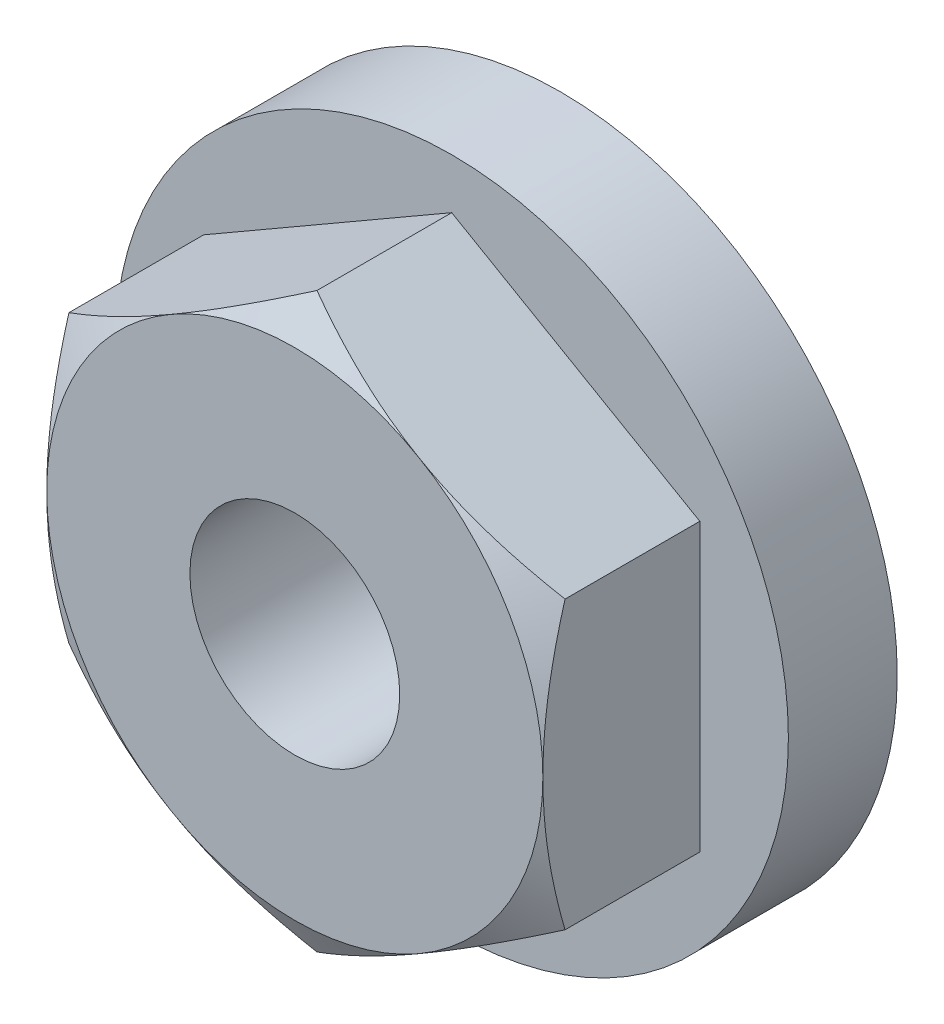
ISO-10303-21;
HEADER;
FILE_DESCRIPTION(('STEP AP214'),'2;1');
FILE_NAME('part.step','',(''),(''),'','','');
FILE_SCHEMA(('AUTOMOTIVE_DESIGN { 1 0 10303 214 1 1 1 1 }'));
ENDSEC;
DATA;
#1=APPLICATION_CONTEXT('core data for automotive mechanical design processes');
#2=APPLICATION_PROTOCOL_DEFINITION('international standard','automotive_design',2000,#1);
#3=PRODUCT_CONTEXT('',#1,'mechanical');
#4=PRODUCT('Part','Part','',(#3));
#5=PRODUCT_RELATED_PRODUCT_CATEGORY('part','',(#4));
#6=PRODUCT_DEFINITION_FORMATION('','',#4);
#7=PRODUCT_DEFINITION_CONTEXT('part definition',#1,'design');
#8=PRODUCT_DEFINITION('design','',#6,#7);
#9=PRODUCT_DEFINITION_SHAPE('','',#8);
#10=(LENGTH_UNIT() NAMED_UNIT(*) SI_UNIT(.MILLI.,.METRE.));
#11=(NAMED_UNIT(*) PLANE_ANGLE_UNIT() SI_UNIT($,.RADIAN.));
#12=(NAMED_UNIT(*) SI_UNIT($,.STERADIAN.) SOLID_ANGLE_UNIT());
#13=UNCERTAINTY_MEASURE_WITH_UNIT(LENGTH_MEASURE(1.E-05),#10,'distance_accuracy_value','');
#14=(GEOMETRIC_REPRESENTATION_CONTEXT(3) GLOBAL_UNCERTAINTY_ASSIGNED_CONTEXT((#13)) GLOBAL_UNIT_ASSIGNED_CONTEXT((#10,
#11,#12)) REPRESENTATION_CONTEXT('',''));
#15=CARTESIAN_POINT('',(0.,0.,0.));
#16=DIRECTION('',(0.,0.,1.));
#17=DIRECTION('',(1.,0.,0.));
#18=AXIS2_PLACEMENT_3D('',#15,#16,#17);
#19=CARTESIAN_POINT('',(5.55625,3.20790243318486,-5.953125));
#20=DIRECTION('',(0.5,0.866025403784439,0.));
#21=DIRECTION('',(-0.866025403784439,0.5,0.));
#22=AXIS2_PLACEMENT_3D('',#19,#20,#21);
#23=PLANE('',#22);
#24=DIRECTION('',(0.,0.,1.));
#25=VECTOR('',#24,1.);
#26=CARTESIAN_POINT('',(0.,6.41580486636972,-5.953125));
#27=LINE('',#26,#25);
#28=CARTESIAN_POINT('',(0.,6.41580486636972,-3.514725));
#29=VERTEX_POINT('',#28);
#30=CARTESIAN_POINT('',(0.,6.41580486636972,-0.496264233481805));
#31=VERTEX_POINT('',#30);
#32=EDGE_CURVE('E133',#29,#31,#27,.T.);
#33=ORIENTED_EDGE('',*,*,#32,.T.);
#34=CARTESIAN_POINT('',(-0.00020000000000129,6.41592033642355,-0.496330901948214));
#35=CARTESIAN_POINT('',(0.12193299556773,6.34540681855559,-0.45562556037127));
#36=CARTESIAN_POINT('',(0.244521362426352,6.27463039195025,-0.416767539363197));
#37=CARTESIAN_POINT('',(0.490693649442354,6.13250275577453,-0.343254933424579));
#38=CARTESIAN_POINT('',(0.614277974736486,6.06115131229835,-0.308602161801911));
#39=CARTESIAN_POINT('',(0.98700972080066,5.84595453837268,-0.211631885561129));
#40=CARTESIAN_POINT('',(1.2376284511895,5.70125974691872,-0.156476054502036));
#41=CARTESIAN_POINT('',(1.61267482827954,5.48472662014719,-0.0917989048470063));
#42=CARTESIAN_POINT('',(1.73598185211002,5.41353527674569,-0.0733741703626362));
#43=CARTESIAN_POINT('',(1.98315307742221,5.27083090327577,-0.0424783662403559));
#44=CARTESIAN_POINT('',(2.10701722869746,5.19931790219406,-0.0300067705620299));
#45=CARTESIAN_POINT('',(2.35496067331701,5.05616768769916,-0.0113350865982913));
#46=CARTESIAN_POINT('',(2.47903956167444,4.98453070810525,-0.00512788068338393));
#47=CARTESIAN_POINT('',(2.72730512667549,4.84119451732138,0.000888582586164164));
#48=CARTESIAN_POINT('',(2.85149179987105,4.76949530812215,0.000698037572721128));
#49=CARTESIAN_POINT('',(3.1917275625322,4.5730600989618,-0.0086182426929013));
#50=CARTESIAN_POINT('',(3.40766529229081,4.44838839255747,-0.024259659689411));
#51=CARTESIAN_POINT('',(3.83810650276474,4.19987304382004,-0.073859904974556));
#52=CARTESIAN_POINT('',(4.05260846955284,4.07603027555323,-0.107835688266667));
#53=CARTESIAN_POINT('',(4.48391602670835,3.82701474132597,-0.192765750048085));
#54=CARTESIAN_POINT('',(4.7006671909081,3.70187339832808,-0.244079888042122));
#55=CARTESIAN_POINT('',(5.13093704534075,3.45345698204721,-0.360542455292395));
#56=CARTESIAN_POINT('',(5.34446124641438,3.33017872707885,-0.425663525879434));
#57=CARTESIAN_POINT('',(5.55645,3.20778696313102,-0.496330901948212));
#58=B_SPLINE_CURVE_WITH_KNOTS('',3,(#34,#35,#36,#37,#38,#39,#40,#41,#42,#43,#44,#45,#46,#47,#48,
#49,#50,#51,#52,#53,#54,#55,#56,#57),.UNSPECIFIED.,.F.,.F.,(4,2,2,2,2,2,2,2,2,2,2,4),(0.,
0.440316908268041,0.880823012040823,1.76366572331169,2.19427472390783,2.62484566732156,
3.05492684132792,3.48499472977669,4.23370964386674,4.98311813377593,5.74914806559356,
6.51367405016872),.UNSPECIFIED.);
#59=CARTESIAN_POINT('',(2.778125,4.81185364977729,0.));
#60=VERTEX_POINT('',#59);
#61=EDGE_CURVE('E62',#31,#60,#58,.T.);
#62=ORIENTED_EDGE('',*,*,#61,.T.);
#63=CARTESIAN_POINT('',(5.55625,3.20790243318486,-0.496264233481803));
#64=VERTEX_POINT('',#63);
#65=EDGE_CURVE('E109',#60,#64,#58,.T.);
#66=ORIENTED_EDGE('',*,*,#65,.T.);
#67=DIRECTION('',(0.,0.,1.));
#68=VECTOR('',#67,1.);
#69=CARTESIAN_POINT('',(5.55625,3.20790243318486,-5.953125));
#70=LINE('',#69,#68);
#71=CARTESIAN_POINT('',(5.55625,3.20790243318486,-3.514725));
#72=VERTEX_POINT('',#71);
#73=EDGE_CURVE('E228',#72,#64,#70,.T.);
#74=ORIENTED_EDGE('',*,*,#73,.F.);
#75=DIRECTION('',(-0.866025403784439,0.5,0.));
#76=VECTOR('',#75,1.);
#77=CARTESIAN_POINT('',(5.55625,3.20790243318486,-3.514725));
#78=LINE('',#77,#76);
#79=EDGE_CURVE('E240',#72,#29,#78,.T.);
#80=ORIENTED_EDGE('',*,*,#79,.T.);
#81=EDGE_LOOP('',(#33,#62,#66,#74,#80));
#82=FACE_BOUND('',#81,.T.);
#83=ADVANCED_FACE('F38',(#82),#23,.T.);
#84=CARTESIAN_POINT('',(5.55625,-3.20790243318486,-5.953125));
#85=DIRECTION('',(1.,0.,0.));
#86=DIRECTION('',(0.,1.,0.));
#87=AXIS2_PLACEMENT_3D('',#84,#85,#86);
#88=PLANE('',#87);
#89=ORIENTED_EDGE('',*,*,#73,.T.);
#90=CARTESIAN_POINT('',(5.55625,-8.68399491005474,-2.74423112435443));
#91=CARTESIAN_POINT('',(5.55625,-8.44071238813783,-2.62594874146931));
#92=CARTESIAN_POINT('',(5.55625,-8.19687848881087,-2.5087813509356));
#93=CARTESIAN_POINT('',(5.55625,-7.7078149113579,-2.27730243738019));
#94=CARTESIAN_POINT('',(5.55625,-7.4625850263919,-2.16299135184691));
#95=CARTESIAN_POINT('',(5.55625,-6.96920529927723,-1.9372903200783));
#96=CARTESIAN_POINT('',(5.55625,-6.72104686846765,-1.82591908493359));
#97=CARTESIAN_POINT('',(5.55625,-6.22277921483376,-1.60764641646315));
#98=CARTESIAN_POINT('',(5.55625,-5.97267008295778,-1.50074477621043));
#99=CARTESIAN_POINT('',(5.55625,-5.46184428471539,-1.28916851922616));
#100=CARTESIAN_POINT('',(5.55625,-5.20104909427566,-1.18468247582605));
#101=CARTESIAN_POINT('',(5.55625,-4.67643244649863,-0.983456930570629));
#102=CARTESIAN_POINT('',(5.55625,-4.41261065705376,-0.886718288311942));
#103=CARTESIAN_POINT('',(5.55625,-3.88199419375103,-0.703477214265698));
#104=CARTESIAN_POINT('',(5.55625,-3.61520654148642,-0.616954646815536));
#105=CARTESIAN_POINT('',(5.55625,-3.07780215682032,-0.456878254095176));
#106=CARTESIAN_POINT('',(5.55625,-2.80718663728072,-0.383320416154831));
#107=CARTESIAN_POINT('',(5.55625,-2.26346638368936,-0.253041663234111));
#108=CARTESIAN_POINT('',(5.55625,-1.99038396194594,-0.196229098730025));
#109=CARTESIAN_POINT('',(5.55625,-1.44071558084913,-0.102629100235993));
#110=CARTESIAN_POINT('',(5.55625,-1.16412998782184,-0.0658395898427517));
#111=CARTESIAN_POINT('',(5.55625,-0.749562558844788,-0.0281119845697549));
#112=CARTESIAN_POINT('',(5.55625,-0.612340888492093,-0.0184532824013619));
#113=CARTESIAN_POINT('',(5.55625,-0.337616393410628,-0.00494664379792282));
#114=CARTESIAN_POINT('',(5.55625,-0.200113596220077,-0.00109816318166069));
#115=CARTESIAN_POINT('',(5.55625,0.0749421323474005,0.000691163131830924));
#116=CARTESIAN_POINT('',(5.55625,0.212495067091348,-0.00136851565554075));
#117=CARTESIAN_POINT('',(5.55625,0.487378845950658,-0.0113432883721766));
#118=CARTESIAN_POINT('',(5.55625,0.624709698074534,-0.0192581662155256));
#119=CARTESIAN_POINT('',(5.55625,0.95268850348551,-0.0449839380863666));
#120=CARTESIAN_POINT('',(5.55625,1.14313211985452,-0.0654579630895699));
#121=CARTESIAN_POINT('',(5.55625,1.52264130373992,-0.116565201640638));
#122=CARTESIAN_POINT('',(5.55625,1.71170668881073,-0.147199736111147));
#123=CARTESIAN_POINT('',(5.55625,2.27659405119699,-0.252722614390295));
#124=CARTESIAN_POINT('',(5.55625,2.64991074841381,-0.341212748653213));
#125=CARTESIAN_POINT('',(5.55625,3.20833213149729,-0.495145496191675));
#126=CARTESIAN_POINT('',(5.55625,3.39631843234373,-0.550739366801617));
#127=CARTESIAN_POINT('',(5.55625,3.77046569824234,-0.667817801385444));
#128=CARTESIAN_POINT('',(5.55625,3.95662664981014,-0.729302408839805));
#129=CARTESIAN_POINT('',(5.55625,4.3271813920907,-0.857165983664275));
#130=CARTESIAN_POINT('',(5.55625,4.51157570000081,-0.92354346585959));
#131=CARTESIAN_POINT('',(5.55625,4.87882686733377,-1.06040000970379));
#132=CARTESIAN_POINT('',(5.55625,5.06168375717878,-1.13087898997335));
#133=CARTESIAN_POINT('',(5.55625,5.53931341885732,-1.32014425816687));
#134=CARTESIAN_POINT('',(5.55625,5.83297980522752,-1.44171947509402));
#135=CARTESIAN_POINT('',(5.55625,6.41742433242896,-1.69164766096787));
#136=CARTESIAN_POINT('',(5.55624999999999,6.70820219189244,-1.82000128264598));
#137=CARTESIAN_POINT('',(5.55624999999999,7.28750450729358,-2.08193685782405));
#138=CARTESIAN_POINT('',(5.55624999999999,7.57602816714153,-2.21552056639607));
#139=CARTESIAN_POINT('',(5.55624999999999,8.1511607736309,-2.48670988867802));
#140=CARTESIAN_POINT('',(5.55624999999999,8.4377697868052,-2.62431536173138));
#141=CARTESIAN_POINT('',(5.55624999999999,9.00985857817239,-2.90290272486426));
#142=CARTESIAN_POINT('',(5.55624999999999,9.29533608720508,-3.04388926561472));
#143=CARTESIAN_POINT('',(5.55624999999999,9.86501872870687,-3.32841040468712));
#144=CARTESIAN_POINT('',(5.55624999999999,10.1492238521068,-3.47194502113488));
#145=CARTESIAN_POINT('',(5.55624999999999,11.0001638399101,-3.90555834554313));
#146=CARTESIAN_POINT('',(5.55624999999999,11.5653362706018,-4.19870204812455));
#147=CARTESIAN_POINT('',(5.55624999999999,12.6361469569359,-4.76078496572285));
#148=CARTESIAN_POINT('',(5.55624999999999,13.1420628655974,-5.02919773815537));
#149=CARTESIAN_POINT('',(5.55624999999999,14.1521616738707,-5.5693281145757));
#150=CARTESIAN_POINT('',(5.55624999999999,14.6563444780897,-5.84104589685548));
#151=CARTESIAN_POINT('',(5.55624999999999,15.6618068300488,-6.38609209435569));
#152=CARTESIAN_POINT('',(5.55624999999999,16.1630905297018,-6.65941286244854));
#153=CARTESIAN_POINT('',(5.55624999999999,17.1645728087885,-7.20795098937644));
#154=CARTESIAN_POINT('',(5.55624999999999,17.6647714635511,-7.48316821062431));
#155=CARTESIAN_POINT('',(5.55624999999999,18.1645847485322,-7.75907911977834));
#156=B_SPLINE_CURVE_WITH_KNOTS('',3,(#90,#91,#92,#93,#94,#95,#96,#97,#98,#99,#100,#101,#102,
#103,#104,#105,#106,#107,#108,#109,#110,#111,#112,#113,#114,#115,#116,#117,#118,#119,#120,#121,
#122,#123,#124,#125,#126,#127,#128,#129,#130,#131,#132,#133,#134,#135,#136,#137,#138,#139,#140,
#141,#142,#143,#144,#145,#146,#147,#148,#149,#150,#151,#152,#153,#154,#155),.UNSPECIFIED.,.F.,
.F.,(4,2,2,2,2,2,2,2,2,2,2,2,2,2,2,2,2,2,2,2,2,2,2,2,2,2,2,2,2,2,2,2,4),(0.,0.811547630396048,
1.62321880955349,2.43919539124873,3.25513415408659,4.09788141298698,4.94072204796686,
5.78187270596739,6.62276256330883,7.45896078973326,8.29507228534598,8.70765151088547,
9.12019209215055,9.53276929698372,9.9453312764292,10.5196314608684,11.0940063368051,
12.2433452126182,12.8313978126471,13.4194547535213,14.0073339258551,14.5952014378355,
15.5485884923271,16.5020675219184,17.4558693020792,18.4096377639481,19.3648033529993,
20.3199757393717,22.229942984196,23.9480593030972,25.6662687221983,27.3791293174056,
29.0918669266135),.UNSPECIFIED.);
#157=CARTESIAN_POINT('',(5.55625,0.,0.));
#158=VERTEX_POINT('',#157);
#159=EDGE_CURVE('E112',#64,#158,#156,.F.);
#160=ORIENTED_EDGE('',*,*,#159,.T.);
#161=CARTESIAN_POINT('',(5.55625,-3.20790243318486,-0.496264233481805));
#162=VERTEX_POINT('',#161);
#163=EDGE_CURVE('E145',#158,#162,#156,.F.);
#164=ORIENTED_EDGE('',*,*,#163,.T.);
#165=DIRECTION('',(0.,0.,1.));
#166=VECTOR('',#165,1.);
#167=CARTESIAN_POINT('',(5.55625,-3.20790243318486,-5.953125));
#168=LINE('',#167,#166);
#169=CARTESIAN_POINT('',(5.55625,-3.20790243318486,-3.514725));
#170=VERTEX_POINT('',#169);
#171=EDGE_CURVE('E233',#170,#162,#168,.T.);
#172=ORIENTED_EDGE('',*,*,#171,.F.);
#173=DIRECTION('',(0.,1.,0.));
#174=VECTOR('',#173,1.);
#175=CARTESIAN_POINT('',(5.55625,-3.20790243318486,-3.514725));
#176=LINE('',#175,#174);
#177=EDGE_CURVE('E231',#170,#72,#176,.T.);
#178=ORIENTED_EDGE('',*,*,#177,.T.);
#179=EDGE_LOOP('',(#89,#160,#164,#172,#178));
#180=FACE_BOUND('',#179,.T.);
#181=ADVANCED_FACE('F199',(#180),#88,.T.);
#182=CARTESIAN_POINT('',(0.,-6.41580486636972,-5.953125));
#183=DIRECTION('',(0.5,-0.866025403784439,0.));
#184=DIRECTION('',(0.866025403784439,0.5,0.));
#185=AXIS2_PLACEMENT_3D('',#182,#183,#184);
#186=PLANE('',#185);
#187=ORIENTED_EDGE('',*,*,#171,.T.);
#188=CARTESIAN_POINT('',(5.55645,-3.20778696313103,-0.496330901948214));
#189=CARTESIAN_POINT('',(5.43431700443226,-3.27830048099899,-0.455625560371269));
#190=CARTESIAN_POINT('',(5.31172863757364,-3.34907690760433,-0.416767539363196));
#191=CARTESIAN_POINT('',(5.06555635055764,-3.49120454378005,-0.343254933424579));
#192=CARTESIAN_POINT('',(4.94197202526351,-3.56255598725623,-0.308602161801911));
#193=CARTESIAN_POINT('',(4.56924027919933,-3.7777527611819,-0.21163188556113));
#194=CARTESIAN_POINT('',(4.31862154881049,-3.92244755263586,-0.156476054502037));
#195=CARTESIAN_POINT('',(3.94357517172046,-4.13898067940739,-0.091798904847007));
#196=CARTESIAN_POINT('',(3.82026814788997,-4.21017202280889,-0.073374170362637));
#197=CARTESIAN_POINT('',(3.57309692257778,-4.35287639627881,-0.0424783662403568));
#198=CARTESIAN_POINT('',(3.44923277130253,-4.42438939736052,-0.0300067705620312));
#199=CARTESIAN_POINT('',(3.20128932668298,-4.56753961185542,-0.0113350865982923));
#200=CARTESIAN_POINT('',(3.07721043832556,-4.63917659144933,-0.00512788068338454));
#201=CARTESIAN_POINT('',(2.82894487332451,-4.7825127822332,0.000888582586163022));
#202=CARTESIAN_POINT('',(2.70475820012895,-4.85421199143242,0.000698037572719024));
#203=CARTESIAN_POINT('',(2.36452243746779,-5.05064720059278,-0.0086182426929045));
#204=CARTESIAN_POINT('',(2.14858470770919,-5.17531890699711,-0.0242596596894132));
#205=CARTESIAN_POINT('',(1.71814349723526,-5.42383425573454,-0.0738599049745579));
#206=CARTESIAN_POINT('',(1.50364153044716,-5.54767702400135,-0.10783568826667));
#207=CARTESIAN_POINT('',(1.07233397329164,-5.79669255822861,-0.192765750048088));
#208=CARTESIAN_POINT('',(0.855582809091897,-5.92183390122649,-0.244079888042125));
#209=CARTESIAN_POINT('',(0.425312954659247,-6.17025031750737,-0.360542455292398));
#210=CARTESIAN_POINT('',(0.21178875358562,-6.29352857247572,-0.425663525879437));
#211=CARTESIAN_POINT('',(-0.00020000000000079,-6.41592033642356,-0.496330901948215));
#212=B_SPLINE_CURVE_WITH_KNOTS('',3,(#188,#189,#190,#191,#192,#193,#194,#195,#196,#197,#198,
#199,#200,#201,#202,#203,#204,#205,#206,#207,#208,#209,#210,#211),.UNSPECIFIED.,.F.,.F.,(4,2,2,
2,2,2,2,2,2,2,2,4),(0.,0.440316908268041,0.880823012040823,1.76366572331169,2.19427472390783,
2.62484566732156,3.05492684132792,3.48499472977669,4.23370964386674,4.98311813377593,
5.74914806559356,6.51367405016872),.UNSPECIFIED.);
#213=CARTESIAN_POINT('',(2.778125,-4.81185364977729,0.));
#214=VERTEX_POINT('',#213);
#215=EDGE_CURVE('E193',#162,#214,#212,.T.);
#216=ORIENTED_EDGE('',*,*,#215,.T.);
#217=CARTESIAN_POINT('',(0.,-6.41580486636972,-0.496264233481806));
#218=VERTEX_POINT('',#217);
#219=EDGE_CURVE('E186',#214,#218,#212,.T.);
#220=ORIENTED_EDGE('',*,*,#219,.T.);
#221=DIRECTION('',(0.,0.,1.));
#222=VECTOR('',#221,1.);
#223=CARTESIAN_POINT('',(0.,-6.41580486636972,-5.953125));
#224=LINE('',#223,#222);
#225=CARTESIAN_POINT('',(0.,-6.41580486636972,-3.514725));
#226=VERTEX_POINT('',#225);
#227=EDGE_CURVE('E237',#226,#218,#224,.T.);
#228=ORIENTED_EDGE('',*,*,#227,.F.);
#229=DIRECTION('',(0.866025403784439,0.5,0.));
#230=VECTOR('',#229,1.);
#231=CARTESIAN_POINT('',(0.,-6.41580486636972,-3.514725));
#232=LINE('',#231,#230);
#233=EDGE_CURVE('E250',#226,#170,#232,.T.);
#234=ORIENTED_EDGE('',*,*,#233,.T.);
#235=EDGE_LOOP('',(#187,#216,#220,#228,#234));
#236=FACE_BOUND('',#235,.T.);
#237=ADVANCED_FACE('F195',(#236),#186,.T.);
#238=CARTESIAN_POINT('',(-5.55625,-3.20790243318486,-5.953125));
#239=DIRECTION('',(-0.5,-0.866025403784439,0.));
#240=DIRECTION('',(0.866025403784439,-0.5,0.));
#241=AXIS2_PLACEMENT_3D('',#238,#239,#240);
#242=PLANE('',#241);
#243=ORIENTED_EDGE('',*,*,#227,.T.);
#244=CARTESIAN_POINT('',(0.000199999999999385,-6.41592033642356,-0.496330901948215));
#245=CARTESIAN_POINT('',(-0.121932995567732,-6.34540681855559,-0.455625560371271));
#246=CARTESIAN_POINT('',(-0.244521362426354,-6.27463039195025,-0.416767539363198));
#247=CARTESIAN_POINT('',(-0.490693649442357,-6.13250275577453,-0.343254933424581));
#248=CARTESIAN_POINT('',(-0.614277974736488,-6.06115131229835,-0.308602161801913));
#249=CARTESIAN_POINT('',(-0.987009720800663,-5.84595453837268,-0.211631885561131));
#250=CARTESIAN_POINT('',(-1.2376284511895,-5.70125974691872,-0.156476054502039));
#251=CARTESIAN_POINT('',(-1.61267482827954,-5.48472662014719,-0.0917989048470077));
#252=CARTESIAN_POINT('',(-1.73598185211002,-5.41353527674569,-0.0733741703626372));
#253=CARTESIAN_POINT('',(-1.98315307742222,-5.27083090327577,-0.0424783662403569));
#254=CARTESIAN_POINT('',(-2.10701722869746,-5.19931790219406,-0.0300067705620317));
#255=CARTESIAN_POINT('',(-2.35496067331702,-5.05616768769916,-0.011335086598293));
#256=CARTESIAN_POINT('',(-2.47903956167444,-4.98453070810525,-0.00512788068338511));
#257=CARTESIAN_POINT('',(-2.72730512667549,-4.84119451732138,0.000888582586162839));
#258=CARTESIAN_POINT('',(-2.85149179987105,-4.76949530812216,0.000698037572719076));
#259=CARTESIAN_POINT('',(-3.19172756253221,-4.5730600989618,-0.00861824269290391));
#260=CARTESIAN_POINT('',(-3.40766529229081,-4.44838839255747,-0.0242596596894124));
#261=CARTESIAN_POINT('',(-3.83810650276474,-4.19987304382004,-0.0738599049745569));
#262=CARTESIAN_POINT('',(-4.05260846955284,-4.07603027555323,-0.107835688266669));
#263=CARTESIAN_POINT('',(-4.48391602670836,-3.82701474132597,-0.192765750048088));
#264=CARTESIAN_POINT('',(-4.7006671909081,-3.70187339832808,-0.244079888042125));
#265=CARTESIAN_POINT('',(-5.13093704534075,-3.45345698204721,-0.360542455292398));
#266=CARTESIAN_POINT('',(-5.34446124641438,-3.33017872707885,-0.425663525879437));
#267=CARTESIAN_POINT('',(-5.55645,-3.20778696313102,-0.496330901948215));
#268=B_SPLINE_CURVE_WITH_KNOTS('',3,(#244,#245,#246,#247,#248,#249,#250,#251,#252,#253,#254,
#255,#256,#257,#258,#259,#260,#261,#262,#263,#264,#265,#266,#267),.UNSPECIFIED.,.F.,.F.,(4,2,2,
2,2,2,2,2,2,2,2,4),(0.,0.440316908268041,0.880823012040824,1.76366572331169,2.19427472390783,
2.62484566732156,3.05492684132792,3.4849947297767,4.23370964386675,4.98311813377593,
5.74914806559357,6.51367405016873),.UNSPECIFIED.);
#269=CARTESIAN_POINT('',(-2.778125,-4.81185364977729,0.));
#270=VERTEX_POINT('',#269);
#271=EDGE_CURVE('E194',#218,#270,#268,.T.);
#272=ORIENTED_EDGE('',*,*,#271,.T.);
#273=CARTESIAN_POINT('',(-5.55625,-3.20790243318534,-0.496264233481485));
#274=VERTEX_POINT('',#273);
#275=EDGE_CURVE('E180',#270,#274,#268,.T.);
#276=ORIENTED_EDGE('',*,*,#275,.T.);
#277=DIRECTION('',(0.,0.,1.));
#278=VECTOR('',#277,1.);
#279=CARTESIAN_POINT('',(-5.55625,-3.20790243318486,-5.953125));
#280=LINE('',#279,#278);
#281=CARTESIAN_POINT('',(-5.55625,-3.20790243318486,-3.514725));
#282=VERTEX_POINT('',#281);
#283=EDGE_CURVE('E245',#282,#274,#280,.T.);
#284=ORIENTED_EDGE('',*,*,#283,.F.);
#285=DIRECTION('',(0.866025403784439,-0.5,0.));
#286=VECTOR('',#285,1.);
#287=CARTESIAN_POINT('',(-5.55625,-3.20790243318486,-3.514725));
#288=LINE('',#287,#286);
#289=EDGE_CURVE('E252',#282,#226,#288,.T.);
#290=ORIENTED_EDGE('',*,*,#289,.T.);
#291=EDGE_LOOP('',(#243,#272,#276,#284,#290));
#292=FACE_BOUND('',#291,.T.);
#293=ADVANCED_FACE('F198',(#292),#242,.T.);
#294=CARTESIAN_POINT('',(-5.55625,3.20790243318486,-5.953125));
#295=DIRECTION('',(-1.,0.,0.));
#296=DIRECTION('',(0.,-1.,0.));
#297=AXIS2_PLACEMENT_3D('',#294,#295,#296);
#298=PLANE('',#297);
#299=ORIENTED_EDGE('',*,*,#283,.T.);
#300=CARTESIAN_POINT('',(-5.55625,-8.68399490865763,-2.74423112367499));
#301=CARTESIAN_POINT('',(-5.55625,-8.44071238678772,-2.62594874081824));
#302=CARTESIAN_POINT('',(-5.55625,-8.1968784875078,-2.50878135031289));
#303=CARTESIAN_POINT('',(-5.55625,-7.70781491014905,-2.27730243681407));
#304=CARTESIAN_POINT('',(-5.55625,-7.46258502523023,-2.16299135130901));
#305=CARTESIAN_POINT('',(-5.55625,-6.96920529821065,-1.93729031959688));
#306=CARTESIAN_POINT('',(-5.55625,-6.72104686744898,-1.8259190844804));
#307=CARTESIAN_POINT('',(-5.55625,-6.22277921391125,-1.60764641606598));
#308=CARTESIAN_POINT('',(-5.55625,-5.9726700820835,-1.50074477584103));
#309=CARTESIAN_POINT('',(-5.55625,-5.46184428394125,-1.28916851891306));
#310=CARTESIAN_POINT('',(-5.55625,-5.20104909355346,-1.18468247554142));
#311=CARTESIAN_POINT('',(-5.55625,-4.67643244588114,-0.983456930341409));
#312=CARTESIAN_POINT('',(-5.55625,-4.41261065648904,-0.886718288109666));
#313=CARTESIAN_POINT('',(-5.55625,-3.88199419329285,-0.703477214114723));
#314=CARTESIAN_POINT('',(-5.55625,-3.61520654108199,-0.616954646688927));
#315=CARTESIAN_POINT('',(-5.55625,-3.07780215652486,-0.456878254013309));
#316=CARTESIAN_POINT('',(-5.55625,-2.80718663704047,-0.383320416093342));
#317=CARTESIAN_POINT('',(-5.55625,-2.26346638358799,-0.253041663213731));
#318=CARTESIAN_POINT('',(-5.55625,-1.99038396192862,-0.196229098728786));
#319=CARTESIAN_POINT('',(-5.55625,-1.44071558100195,-0.102629100260319));
#320=CARTESIAN_POINT('',(-5.55625,-1.16412998806076,-0.0658395898735119));
#321=CARTESIAN_POINT('',(-5.55625,-0.749562559212246,-0.028111984598734));
#322=CARTESIAN_POINT('',(-5.55625,-0.61234088890178,-0.018453282427893));
#323=CARTESIAN_POINT('',(-5.55625,-0.337616393904681,-0.00494664381583912));
#324=CARTESIAN_POINT('',(-5.55625,-0.200113596756267,-0.00109816319341067));
#325=CARTESIAN_POINT('',(-5.55625,0.0749421317272436,0.000691163136054456));
#326=CARTESIAN_POINT('',(-5.55625,0.212495066429362,-0.00136851564150872));
#327=CARTESIAN_POINT('',(-5.55625,0.48737884520557,-0.0113432883351523));
#328=CARTESIAN_POINT('',(-5.55625,0.624709697288174,-0.0192581661653177));
#329=CARTESIAN_POINT('',(-5.55625,0.952688502635255,-0.0449839380037341));
#330=CARTESIAN_POINT('',(-5.55625,1.14313211898183,-0.0654579629882622));
#331=CARTESIAN_POINT('',(-5.55625,1.52264130282336,-0.116565201500979));
#332=CARTESIAN_POINT('',(-5.55625,1.71170668787275,-0.147199735951811));
#333=CARTESIAN_POINT('',(-5.55625,2.27659405019588,-0.252722614171514));
#334=CARTESIAN_POINT('',(-5.55625,2.64991074737226,-0.341212748394274));
#335=CARTESIAN_POINT('',(-5.55625,3.20833213039524,-0.495145495873464));
#336=CARTESIAN_POINT('',(-5.55625,3.39631843122109,-0.55073936646351));
#337=CARTESIAN_POINT('',(-5.55625,3.77046569707873,-0.667817801008148));
#338=CARTESIAN_POINT('',(-5.55625,3.95662664862616,-0.729302408443215));
#339=CARTESIAN_POINT('',(-5.55625,4.32718139086614,-0.85716598322978));
#340=CARTESIAN_POINT('',(-5.55625,4.51157569875603,-0.923543465406485));
#341=CARTESIAN_POINT('',(-5.55625,4.87882686604855,-1.06040000921411));
#342=CARTESIAN_POINT('',(-5.55625,5.06168375587333,-1.13087898946569));
#343=CARTESIAN_POINT('',(-5.55625,5.53931341753975,-1.3201442576291));
#344=CARTESIAN_POINT('',(-5.55625,5.83297980391751,-1.44171947454583));
#345=CARTESIAN_POINT('',(-5.55625,6.4174243311331,-1.69164766040173));
#346=CARTESIAN_POINT('',(-5.55625,6.70820219060318,-1.82000128207232));
#347=CARTESIAN_POINT('',(-5.55625,7.28750450601683,-2.08193685723748));
#348=CARTESIAN_POINT('',(-5.55625,7.57602816587069,-2.2155205658041));
#349=CARTESIAN_POINT('',(-5.55625,8.15116077237124,-2.48670988807679));
#350=CARTESIAN_POINT('',(-5.55625,8.4377697855508,-2.62431536112629));
#351=CARTESIAN_POINT('',(-5.55625,9.00985857692835,-2.90290272425271));
#352=CARTESIAN_POINT('',(-5.55625,9.29533608596613,-3.04388926500057));
#353=CARTESIAN_POINT('',(-5.55625,9.86501872747772,-3.32841040406864));
#354=CARTESIAN_POINT('',(-5.55625,10.1492238508824,-3.47194502051465));
#355=CARTESIAN_POINT('',(-5.55625,11.0001638386992,-3.9055583449186));
#356=CARTESIAN_POINT('',(-5.55625,11.5653362693993,-4.19870204749842));
#357=CARTESIAN_POINT('',(-5.55625,12.6361469557419,-4.76078496509157));
#358=CARTESIAN_POINT('',(-5.55625,13.1420628644035,-5.02919773752034));
#359=CARTESIAN_POINT('',(-5.55625,14.1521616726768,-5.56932811393393));
#360=CARTESIAN_POINT('',(-5.55625,14.6563444768956,-5.84104589621072));
#361=CARTESIAN_POINT('',(-5.55625,15.6618068288529,-6.38609209370488));
#362=CARTESIAN_POINT('',(-5.55625,16.1630905285044,-6.65941286179464));
#363=CARTESIAN_POINT('',(-5.55625,17.1645728075876,-7.20795098871674));
#364=CARTESIAN_POINT('',(-5.55625,17.6647714623484,-7.48316820996187));
#365=CARTESIAN_POINT('',(-5.55625,18.1645847473276,-7.75907911911329));
#366=B_SPLINE_CURVE_WITH_KNOTS('',3,(#300,#301,#302,#303,#304,#305,#306,#307,#308,#309,#310,
#311,#312,#313,#314,#315,#316,#317,#318,#319,#320,#321,#322,#323,#324,#325,#326,#327,#328,#329,
#330,#331,#332,#333,#334,#335,#336,#337,#338,#339,#340,#341,#342,#343,#344,#345,#346,#347,#348,
#349,#350,#351,#352,#353,#354,#355,#356,#357,#358,#359,#360,#361,#362,#363,#364,#365),
.UNSPECIFIED.,.F.,.F.,(4,2,2,2,2,2,2,2,2,2,2,2,2,2,2,2,2,2,2,2,2,2,2,2,2,2,2,2,2,2,2,2,4),(0.,
0.811547630232006,1.62321880922538,2.43919539075479,3.25513415342684,4.09788141215085,
4.9407220469543,5.78187270477897,6.62276256194471,7.45896078811112,8.29507228346621,
8.70765150887994,9.1201920900193,9.53276929472667,9.94533127404636,10.5196314584127,
11.0940063342765,12.2433452099435,12.8313978098963,13.4194547506943,14.007333922952,
14.5952014348564,15.5485884893569,16.5020675189572,17.4558692991273,18.4096377610053,
19.3648033500667,20.3199757364494,22.2299429812938,23.9480593001902,25.6662687192865,
27.3791293144852,29.0918669236843),.UNSPECIFIED.);
#367=CARTESIAN_POINT('',(-5.55625,0.,0.));
#368=VERTEX_POINT('',#367);
#369=EDGE_CURVE('E276',#274,#368,#366,.T.);
#370=ORIENTED_EDGE('',*,*,#369,.T.);
#371=CARTESIAN_POINT('',(-5.55625,3.20790243318486,-0.496264233481806));
#372=VERTEX_POINT('',#371);
#373=EDGE_CURVE('E173',#368,#372,#366,.T.);
#374=ORIENTED_EDGE('',*,*,#373,.T.);
#375=DIRECTION('',(0.,0.,1.));
#376=VECTOR('',#375,1.);
#377=CARTESIAN_POINT('',(-5.55625,3.20790243318486,-5.953125));
#378=LINE('',#377,#376);
#379=CARTESIAN_POINT('',(-5.55625,3.20790243318486,-3.514725));
#380=VERTEX_POINT('',#379);
#381=EDGE_CURVE('E248',#380,#372,#378,.T.);
#382=ORIENTED_EDGE('',*,*,#381,.F.);
#383=DIRECTION('',(0.,-1.,0.));
#384=VECTOR('',#383,1.);
#385=CARTESIAN_POINT('',(-5.55625,3.20790243318486,-3.514725));
#386=LINE('',#385,#384);
#387=EDGE_CURVE('E257',#380,#282,#386,.T.);
#388=ORIENTED_EDGE('',*,*,#387,.T.);
#389=EDGE_LOOP('',(#299,#370,#374,#382,#388));
#390=FACE_BOUND('',#389,.T.);
#391=ADVANCED_FACE('F205',(#390),#298,.T.);
#392=CARTESIAN_POINT('',(0.,6.41580486636972,-5.953125));
#393=DIRECTION('',(-0.5,0.866025403784439,0.));
#394=DIRECTION('',(-0.866025403784439,-0.5,0.));
#395=AXIS2_PLACEMENT_3D('',#392,#393,#394);
#396=PLANE('',#395);
#397=ORIENTED_EDGE('',*,*,#381,.T.);
#398=CARTESIAN_POINT('',(-5.55645,3.20778696313102,-0.496330901948216));
#399=CARTESIAN_POINT('',(-5.43431700443227,3.27830048099899,-0.455625560371271));
#400=CARTESIAN_POINT('',(-5.31172863757365,3.34907690760433,-0.416767539363198));
#401=CARTESIAN_POINT('',(-5.06555635055765,3.49120454378004,-0.34325493342458));
#402=CARTESIAN_POINT('',(-4.94197202526351,3.56255598725623,-0.308602161801912));
#403=CARTESIAN_POINT('',(-4.56924027919934,3.7777527611819,-0.211631885561131));
#404=CARTESIAN_POINT('',(-4.3186215488105,3.92244755263586,-0.156476054502038));
#405=CARTESIAN_POINT('',(-3.94357517172046,4.13898067940738,-0.0917989048470075));
#406=CARTESIAN_POINT('',(-3.82026814788998,4.21017202280889,-0.0733741703626371));
#407=CARTESIAN_POINT('',(-3.57309692257779,4.35287639627881,-0.0424783662403571));
#408=CARTESIAN_POINT('',(-3.44923277130254,4.42438939736052,-0.0300067705620319));
#409=CARTESIAN_POINT('',(-3.20128932668299,4.56753961185542,-0.0113350865982928));
#410=CARTESIAN_POINT('',(-3.07721043832556,4.63917659144933,-0.00512788068338447));
#411=CARTESIAN_POINT('',(-2.82894487332451,4.7825127822332,0.000888582586163694));
#412=CARTESIAN_POINT('',(-2.70475820012895,4.85421199143242,0.00069803757271971));
#413=CARTESIAN_POINT('',(-2.36452243746779,5.05064720059278,-0.00861824269290365));
#414=CARTESIAN_POINT('',(-2.14858470770919,5.1753189069971,-0.0242596596894121));
#415=CARTESIAN_POINT('',(-1.71814349723526,5.42383425573453,-0.0738599049745566));
#416=CARTESIAN_POINT('',(-1.50364153044716,5.54767702400135,-0.107835688266668));
#417=CARTESIAN_POINT('',(-1.07233397329164,5.79669255822861,-0.192765750048087));
#418=CARTESIAN_POINT('',(-0.855582809091901,5.92183390122649,-0.244079888042124));
#419=CARTESIAN_POINT('',(-0.42531295465925,6.17025031750736,-0.360542455292397));
#420=CARTESIAN_POINT('',(-0.211788753585623,6.29352857247572,-0.425663525879436));
#421=CARTESIAN_POINT('',(0.000199999999998121,6.41592033642355,-0.496330901948214));
#422=B_SPLINE_CURVE_WITH_KNOTS('',3,(#398,#399,#400,#401,#402,#403,#404,#405,#406,#407,#408,
#409,#410,#411,#412,#413,#414,#415,#416,#417,#418,#419,#420,#421),.UNSPECIFIED.,.F.,.F.,(4,2,2,
2,2,2,2,2,2,2,2,4),(0.,0.440316908268042,0.880823012040824,1.76366572331169,2.19427472390783,
2.62484566732156,3.05492684132792,3.4849947297767,4.23370964386675,4.98311813377593,
5.74914806559356,6.51367405016873),.UNSPECIFIED.);
#423=CARTESIAN_POINT('',(-2.778125,4.81185364977729,0.));
#424=VERTEX_POINT('',#423);
#425=EDGE_CURVE('E278',#372,#424,#422,.T.);
#426=ORIENTED_EDGE('',*,*,#425,.T.);
#427=EDGE_CURVE('E118',#424,#31,#422,.T.);
#428=ORIENTED_EDGE('',*,*,#427,.T.);
#429=ORIENTED_EDGE('',*,*,#32,.F.);
#430=DIRECTION('',(-0.866025403784439,-0.5,0.));
#431=VECTOR('',#430,1.);
#432=CARTESIAN_POINT('',(0.,6.41580486636972,-3.514725));
#433=LINE('',#432,#431);
#434=EDGE_CURVE('E232',#29,#380,#433,.T.);
#435=ORIENTED_EDGE('',*,*,#434,.T.);
#436=EDGE_LOOP('',(#397,#426,#428,#429,#435));
#437=FACE_BOUND('',#436,.T.);
#438=ADVANCED_FACE('F209',(#437),#396,.T.);
#439=CARTESIAN_POINT('',(0.,0.,-3.514725));
#440=DIRECTION('',(0.,0.,-1.));
#441=DIRECTION('',(-1.,0.,0.));
#442=AXIS2_PLACEMENT_3D('',#439,#440,#441);
#443=CYLINDRICAL_SURFACE('',#442,7.540625);
#444=CARTESIAN_POINT('',(0.,0.,-3.514725));
#445=DIRECTION('',(0.,0.,-1.));
#446=DIRECTION('',(-1.,0.,0.));
#447=AXIS2_PLACEMENT_3D('',#444,#445,#446);
#448=CIRCLE('',#447,7.540625);
#449=CARTESIAN_POINT('',(-7.540625,0.,-3.514725));
#450=VERTEX_POINT('',#449);
#451=EDGE_CURVE('E136',#450,#450,#448,.T.);
#452=ORIENTED_EDGE('',*,*,#451,.T.);
#453=EDGE_LOOP('',(#452));
#454=FACE_BOUND('',#453,.T.);
#455=CARTESIAN_POINT('',(0.,0.,-5.953125));
#456=DIRECTION('',(0.,0.,-1.));
#457=DIRECTION('',(-1.,0.,0.));
#458=AXIS2_PLACEMENT_3D('',#455,#456,#457);
#459=CIRCLE('',#458,7.540625);
#460=CARTESIAN_POINT('',(-7.540625,0.,-5.953125));
#461=VERTEX_POINT('',#460);
#462=EDGE_CURVE('E134',#461,#461,#459,.T.);
#463=ORIENTED_EDGE('',*,*,#462,.F.);
#464=EDGE_LOOP('',(#463));
#465=FACE_BOUND('',#464,.T.);
#466=ADVANCED_FACE('F213',(#454,#465),#443,.T.);
#467=CARTESIAN_POINT('',(0.,0.,-3.514725));
#468=DIRECTION('',(0.,0.,-1.));
#469=DIRECTION('',(-1.,0.,0.));
#470=AXIS2_PLACEMENT_3D('',#467,#468,#469);
#471=PLANE('',#470);
#472=ORIENTED_EDGE('',*,*,#79,.F.);
#473=ORIENTED_EDGE('',*,*,#177,.F.);
#474=ORIENTED_EDGE('',*,*,#233,.F.);
#475=ORIENTED_EDGE('',*,*,#289,.F.);
#476=ORIENTED_EDGE('',*,*,#387,.F.);
#477=ORIENTED_EDGE('',*,*,#434,.F.);
#478=EDGE_LOOP('',(#472,#473,#474,#475,#476,#477));
#479=FACE_BOUND('',#478,.T.);
#480=ORIENTED_EDGE('',*,*,#451,.F.);
#481=EDGE_LOOP('',(#480));
#482=FACE_BOUND('',#481,.T.);
#483=ADVANCED_FACE('F160',(#479,#482),#471,.F.);
#484=CARTESIAN_POINT('',(-5.55625,9.62370729955457,-5.953125));
#485=DIRECTION('',(0.,0.,1.));
#486=DIRECTION('',(1.,0.,0.));
#487=AXIS2_PLACEMENT_3D('',#484,#485,#486);
#488=PLANE('',#487);
#489=ORIENTED_EDGE('',*,*,#462,.T.);
#490=EDGE_LOOP('',(#489));
#491=FACE_BOUND('',#490,.T.);
#492=CARTESIAN_POINT('',(0.,0.,-5.953125));
#493=DIRECTION('',(0.,0.,1.));
#494=DIRECTION('',(1.,0.,0.));
#495=AXIS2_PLACEMENT_3D('',#492,#493,#494);
#496=CIRCLE('',#495,2.35011080289533);
#497=CARTESIAN_POINT('',(2.35011080289533,0.,-5.953125));
#498=VERTEX_POINT('',#497);
#499=EDGE_CURVE('E128',#498,#498,#496,.F.);
#500=ORIENTED_EDGE('',*,*,#499,.F.);
#501=EDGE_LOOP('',(#500));
#502=FACE_BOUND('',#501,.T.);
#503=ADVANCED_FACE('F266',(#491,#502),#488,.F.);
#504=CARTESIAN_POINT('',(0.,0.,0.));
#505=DIRECTION('',(0.,0.,-1.));
#506=DIRECTION('',(1.,0.,0.));
#507=AXIS2_PLACEMENT_3D('',#504,#505,#506);
#508=CONICAL_SURFACE('',#507,5.55625,1.0471975511966);
#509=CARTESIAN_POINT('',(0.,0.,0.));
#510=DIRECTION('',(0.,0.,1.));
#511=DIRECTION('',(1.,0.,0.));
#512=AXIS2_PLACEMENT_3D('',#509,#510,#511);
#513=CIRCLE('',#512,5.55625);
#514=EDGE_CURVE('E42',#214,#158,#513,.T.);
#515=ORIENTED_EDGE('',*,*,#514,.F.);
#516=ORIENTED_EDGE('',*,*,#215,.F.);
#517=ORIENTED_EDGE('',*,*,#163,.F.);
#518=EDGE_LOOP('',(#515,#516,#517));
#519=FACE_BOUND('',#518,.T.);
#520=ADVANCED_FACE('F271',(#519),#508,.T.);
#521=EDGE_CURVE('E281',#270,#214,#513,.T.);
#522=ORIENTED_EDGE('',*,*,#521,.F.);
#523=ORIENTED_EDGE('',*,*,#271,.F.);
#524=ORIENTED_EDGE('',*,*,#219,.F.);
#525=EDGE_LOOP('',(#522,#523,#524));
#526=FACE_BOUND('',#525,.T.);
#527=ADVANCED_FACE('F289',(#526),#508,.T.);
#528=EDGE_CURVE('E280',#368,#270,#513,.T.);
#529=ORIENTED_EDGE('',*,*,#528,.F.);
#530=ORIENTED_EDGE('',*,*,#369,.F.);
#531=ORIENTED_EDGE('',*,*,#275,.F.);
#532=EDGE_LOOP('',(#529,#530,#531));
#533=FACE_BOUND('',#532,.T.);
#534=ADVANCED_FACE('F157',(#533),#508,.T.);
#535=EDGE_CURVE('E47',#424,#368,#513,.T.);
#536=ORIENTED_EDGE('',*,*,#535,.F.);
#537=ORIENTED_EDGE('',*,*,#425,.F.);
#538=ORIENTED_EDGE('',*,*,#373,.F.);
#539=EDGE_LOOP('',(#536,#537,#538));
#540=FACE_BOUND('',#539,.T.);
#541=ADVANCED_FACE('F152',(#540),#508,.T.);
#542=ORIENTED_EDGE('',*,*,#427,.F.);
#543=EDGE_CURVE('E12',#60,#424,#513,.T.);
#544=ORIENTED_EDGE('',*,*,#543,.F.);
#545=ORIENTED_EDGE('',*,*,#61,.F.);
#546=EDGE_LOOP('',(#542,#544,#545));
#547=FACE_BOUND('',#546,.T.);
#548=ADVANCED_FACE('F117',(#547),#508,.T.);
#549=CARTESIAN_POINT('',(0.,0.,0.));
#550=DIRECTION('',(0.,0.,1.));
#551=DIRECTION('',(1.,0.,0.));
#552=AXIS2_PLACEMENT_3D('',#549,#550,#551);
#553=CIRCLE('',#552,5.55625);
#554=EDGE_CURVE('E54',#158,#60,#553,.T.);
#555=ORIENTED_EDGE('',*,*,#554,.F.);
#556=ORIENTED_EDGE('',*,*,#159,.F.);
#557=ORIENTED_EDGE('',*,*,#65,.F.);
#558=EDGE_LOOP('',(#555,#556,#557));
#559=FACE_BOUND('',#558,.T.);
#560=ADVANCED_FACE('F110',(#559),#508,.T.);
#561=CARTESIAN_POINT('',(-5.55625,9.62370729955457,0.));
#562=DIRECTION('',(0.,0.,1.));
#563=DIRECTION('',(1.,0.,0.));
#564=AXIS2_PLACEMENT_3D('',#561,#562,#563);
#565=PLANE('',#564);
#566=ORIENTED_EDGE('',*,*,#514,.T.);
#567=ORIENTED_EDGE('',*,*,#554,.T.);
#568=ORIENTED_EDGE('',*,*,#543,.T.);
#569=ORIENTED_EDGE('',*,*,#535,.T.);
#570=ORIENTED_EDGE('',*,*,#528,.T.);
#571=ORIENTED_EDGE('',*,*,#521,.T.);
#572=EDGE_LOOP('',(#566,#567,#568,#569,#570,#571));
#573=FACE_BOUND('',#572,.T.);
#574=CARTESIAN_POINT('',(0.,0.,0.));
#575=DIRECTION('',(0.,0.,1.));
#576=DIRECTION('',(1.,0.,0.));
#577=AXIS2_PLACEMENT_3D('',#574,#575,#576);
#578=CIRCLE('',#577,2.35011080289533);
#579=CARTESIAN_POINT('',(2.35011080289533,0.,0.));
#580=VERTEX_POINT('',#579);
#581=EDGE_CURVE('E395',#580,#580,#578,.T.);
#582=ORIENTED_EDGE('',*,*,#581,.F.);
#583=EDGE_LOOP('',(#582));
#584=FACE_BOUND('',#583,.T.);
#585=ADVANCED_FACE('F124',(#573,#584),#565,.T.);
#586=CARTESIAN_POINT('',(0.,0.,-14.9333811210692));
#587=DIRECTION('',(0.,0.,1.));
#588=DIRECTION('',(1.,0.,0.));
#589=AXIS2_PLACEMENT_3D('',#586,#587,#588);
#590=CYLINDRICAL_SURFACE('',#589,2.35011080289533);
#591=ORIENTED_EDGE('',*,*,#499,.T.);
#592=EDGE_LOOP('',(#591));
#593=FACE_BOUND('',#592,.T.);
#594=ORIENTED_EDGE('',*,*,#581,.T.);
#595=EDGE_LOOP('',(#594));
#596=FACE_BOUND('',#595,.T.);
#597=ADVANCED_FACE('F159',(#593,#596),#590,.F.);
#598=CLOSED_SHELL('',(#83,#181,#237,#293,#391,#438,#466,#483,#503,#520,#527,#534,#541,#548,#560,
#585,#597));
#599=MANIFOLD_SOLID_BREP('B2',#598);
#600=ADVANCED_BREP_SHAPE_REPRESENTATION('',(#18,#599),#14);
#601=SHAPE_DEFINITION_REPRESENTATION(#9,#600);
ENDSEC;
END-ISO-10303-21;
